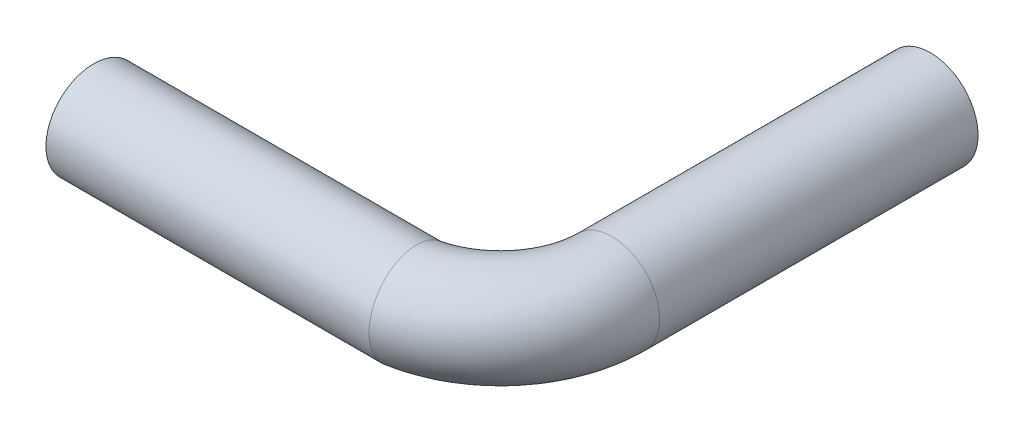
ISO-10303-21;
HEADER;
FILE_DESCRIPTION(('STEP AP214'),'2;1');
FILE_NAME('part.step','',(''),(''),'','','');
FILE_SCHEMA(('AUTOMOTIVE_DESIGN { 1 0 10303 214 1 1 1 1 }'));
ENDSEC;
DATA;
#1=APPLICATION_CONTEXT('core data for automotive mechanical design processes');
#2=APPLICATION_PROTOCOL_DEFINITION('international standard','automotive_design',2000,#1);
#3=PRODUCT_CONTEXT('',#1,'mechanical');
#4=PRODUCT('Part','Part','',(#3));
#5=PRODUCT_RELATED_PRODUCT_CATEGORY('part','',(#4));
#6=PRODUCT_DEFINITION_FORMATION('','',#4);
#7=PRODUCT_DEFINITION_CONTEXT('part definition',#1,'design');
#8=PRODUCT_DEFINITION('design','',#6,#7);
#9=PRODUCT_DEFINITION_SHAPE('','',#8);
#10=(LENGTH_UNIT() NAMED_UNIT(*) SI_UNIT(.MILLI.,.METRE.));
#11=(NAMED_UNIT(*) PLANE_ANGLE_UNIT() SI_UNIT($,.RADIAN.));
#12=(NAMED_UNIT(*) SI_UNIT($,.STERADIAN.) SOLID_ANGLE_UNIT());
#13=UNCERTAINTY_MEASURE_WITH_UNIT(LENGTH_MEASURE(1.E-05),#10,'distance_accuracy_value','');
#14=(GEOMETRIC_REPRESENTATION_CONTEXT(3) GLOBAL_UNCERTAINTY_ASSIGNED_CONTEXT((#13)) GLOBAL_UNIT_ASSIGNED_CONTEXT((#10,
#11,#12)) REPRESENTATION_CONTEXT('',''));
#15=CARTESIAN_POINT('',(0.,0.,0.));
#16=DIRECTION('',(0.,0.,1.));
#17=DIRECTION('',(1.,0.,0.));
#18=AXIS2_PLACEMENT_3D('',#15,#16,#17);
#19=CARTESIAN_POINT('',(-65.472312703583,0.,58.3061889250815));
#20=DIRECTION('',(1.,0.,0.));
#21=DIRECTION('',(0.,0.,-1.));
#22=AXIS2_PLACEMENT_3D('',#19,#20,#21);
#23=PLANE('',#22);
#24=CARTESIAN_POINT('',(-65.472312703583,0.,58.3061889250815));
#25=DIRECTION('',(1.,0.,0.));
#26=DIRECTION('',(0.,0.,-1.));
#27=AXIS2_PLACEMENT_3D('',#24,#25,#26);
#28=CIRCLE('',#27,15.);
#29=CARTESIAN_POINT('',(-65.472312703583,0.,43.3061889250815));
#30=VERTEX_POINT('',#29);
#31=EDGE_CURVE('E50',#30,#30,#28,.T.);
#32=ORIENTED_EDGE('',*,*,#31,.F.);
#33=EDGE_LOOP('',(#32));
#34=FACE_BOUND('',#33,.T.);
#35=ADVANCED_FACE('F47',(#34),#23,.F.);
#36=CARTESIAN_POINT('',(62.8585777324741,0.,-76.0525505399241));
#37=DIRECTION('',(0.,0.,-1.));
#38=DIRECTION('',(-1.,0.,0.));
#39=AXIS2_PLACEMENT_3D('',#36,#37,#38);
#40=PLANE('',#39);
#41=CARTESIAN_POINT('',(62.8585777324741,0.,-76.0525505399241));
#42=DIRECTION('',(0.,0.,-1.));
#43=DIRECTION('',(-1.,0.,0.));
#44=AXIS2_PLACEMENT_3D('',#41,#42,#43);
#45=CIRCLE('',#44,15.);
#46=CARTESIAN_POINT('',(47.8585777324741,0.,-76.0525505399241));
#47=VERTEX_POINT('',#46);
#48=EDGE_CURVE('E75',#47,#47,#45,.T.);
#49=ORIENTED_EDGE('',*,*,#48,.T.);
#50=EDGE_LOOP('',(#49));
#51=FACE_BOUND('',#50,.T.);
#52=ADVANCED_FACE('F70',(#51),#40,.T.);
#53=CARTESIAN_POINT('',(36.2142257579554,0.,58.3061889250814));
#54=DIRECTION('',(-1.,0.,0.));
#55=DIRECTION('',(0.,0.,1.));
#56=AXIS2_PLACEMENT_3D('',#53,#54,#55);
#57=CYLINDRICAL_SURFACE('',#56,15.);
#58=CARTESIAN_POINT('',(34.527687296417,15.,58.3061889250814));
#59=CARTESIAN_POINT('',(34.5258970146689,15.0000000568566,58.2875707761179));
#60=CARTESIAN_POINT('',(34.5241059795635,14.9999653888742,58.2689521512693));
#61=CARTESIAN_POINT('',(34.4816199437743,14.9983201625483,57.8274655230703));
#62=CARTESIAN_POINT('',(34.4405440041453,14.9788367600335,57.4044380138404));
#63=CARTESIAN_POINT('',(34.378575970563,14.9228796147085,56.7723984871578));
#64=CARTESIAN_POINT('',(34.357852185721,14.8997566024416,56.5620480355102));
#65=CARTESIAN_POINT('',(34.3163190895518,14.8446313444666,56.1424677826833));
#66=CARTESIAN_POINT('',(34.2955097617497,14.8126273010082,55.9332382171501));
#67=CARTESIAN_POINT('',(34.2329098435563,14.7031999281993,55.3068905763646));
#68=CARTESIAN_POINT('',(34.1910374429678,14.6124427853828,54.8920330714811));
#69=CARTESIAN_POINT('',(34.1073968922888,14.3961034765611,54.0715380893639));
#70=CARTESIAN_POINT('',(34.0656287439181,14.2705207398372,53.6659007633475));
#71=CARTESIAN_POINT('',(33.9825484946131,13.9855660027348,52.8671138993205));
#72=CARTESIAN_POINT('',(33.9412359456726,13.8262310322062,52.4739512144087));
#73=CARTESIAN_POINT('',(33.8593497904146,13.474803792978,51.7024506999752));
#74=CARTESIAN_POINT('',(33.8187762176678,13.2827100401831,51.3241135430608));
#75=CARTESIAN_POINT('',(33.7387423475721,12.8672597301733,50.5852346499254));
#76=CARTESIAN_POINT('',(33.6992812995707,12.6439248897161,50.224680785425));
#77=CARTESIAN_POINT('',(33.6218025239209,12.1674569763935,49.5236723406661));
#78=CARTESIAN_POINT('',(33.5837847782771,11.914324275218,49.1832175097776));
#79=CARTESIAN_POINT('',(33.5095892872261,11.3802270316736,48.5250898922464));
#80=CARTESIAN_POINT('',(33.4734102107917,11.0992830692625,48.207400555147));
#81=CARTESIAN_POINT('',(33.4032383806132,10.5113757941377,47.596819676194));
#82=CARTESIAN_POINT('',(33.3692456335615,10.2044124017864,47.3039282102447));
#83=CARTESIAN_POINT('',(33.3038208467741,9.56658728805955,46.7450374142214));
#84=CARTESIAN_POINT('',(33.2723891211525,9.2357226445108,46.4790413819626));
#85=CARTESIAN_POINT('',(33.2124645245376,8.55246846660784,45.9759306266298));
#86=CARTESIAN_POINT('',(33.1839716397633,8.20007903320136,45.7388157681234));
#87=CARTESIAN_POINT('',(33.1304159712215,7.47804958774924,45.2963009457944));
#88=CARTESIAN_POINT('',(33.1053371164994,7.10850222007245,45.0907517611364));
#89=CARTESIAN_POINT('',(33.0587784762073,6.35319268905035,44.7115016921926));
#90=CARTESIAN_POINT('',(33.0372986811233,5.96743056857186,44.5378007237163));
#91=CARTESIAN_POINT('',(32.9982387681624,5.18246603191532,44.223548316022));
#92=CARTESIAN_POINT('',(32.9806584259885,4.78326439030201,44.0829949701198));
#93=CARTESIAN_POINT('',(32.94965196609,3.97426607702596,43.8360794781368));
#94=CARTESIAN_POINT('',(32.9362258277977,3.56446945783018,43.7297171627749));
#95=CARTESIAN_POINT('',(32.9138084774522,2.7401161733403,43.552604283818));
#96=CARTESIAN_POINT('',(32.9047870880695,2.32561239221796,43.4816113311416));
#97=CARTESIAN_POINT('',(32.8911783481355,1.49203734757327,43.3746654561419));
#98=CARTESIAN_POINT('',(32.8865909763259,1.07296610595869,43.3387123658253));
#99=CARTESIAN_POINT('',(32.8819214816627,0.233270692588299,43.3021165516213));
#100=CARTESIAN_POINT('',(32.8818392418182,-0.187353438557801,43.3014729108045));
#101=CARTESIAN_POINT('',(32.8861810051607,-1.02714726664923,43.3354985528378));
#102=CARTESIAN_POINT('',(32.8906050009043,-1.44631696599584,43.3701677773581));
#103=CARTESIAN_POINT('',(32.9038619835599,-2.27840682703837,43.4743341677916));
#104=CARTESIAN_POINT('',(32.9126759790514,-2.69134608208205,43.543681319888));
#105=CARTESIAN_POINT('',(32.9345698585346,-3.50987515276862,43.7166121886742));
#106=CARTESIAN_POINT('',(32.9476497271113,-3.9154649949634,43.8201957816488));
#107=CARTESIAN_POINT('',(32.9778823979753,-4.7164403421658,44.0608366379397));
#108=CARTESIAN_POINT('',(32.9950352708174,-5.11182567027344,44.1978944811173));
#109=CARTESIAN_POINT('',(33.033169056893,-5.88961012783061,44.5044778086699));
#110=CARTESIAN_POINT('',(33.0541499822617,-6.27200921610792,44.6740033959709));
#111=CARTESIAN_POINT('',(33.0997055476351,-7.02201803919799,45.0447164607831));
#112=CARTESIAN_POINT('',(33.1242883752193,-7.38959157929288,45.2459761554803));
#113=CARTESIAN_POINT('',(33.1766902746422,-8.10645138456053,45.6784151550098));
#114=CARTESIAN_POINT('',(33.2045093497324,-8.45573763135974,45.909594489902));
#115=CARTESIAN_POINT('',(33.2630381174555,-9.13358500731653,46.400196479165));
#116=CARTESIAN_POINT('',(33.2937476310764,-9.46214741785112,46.65961738462));
#117=CARTESIAN_POINT('',(33.3577016376559,-10.0963108147469,47.2048658033168));
#118=CARTESIAN_POINT('',(33.3909461376827,-10.4019117370814,47.4906933901871));
#119=CARTESIAN_POINT('',(33.4598296812589,-10.9899563736595,48.088663136045));
#120=CARTESIAN_POINT('',(33.4954828167249,-11.2722375941045,48.40096348014));
#121=CARTESIAN_POINT('',(33.5686213843518,-11.8094738339934,49.0480483413191));
#122=CARTESIAN_POINT('',(33.6061068388033,-12.0644285208815,49.3828331319516));
#123=CARTESIAN_POINT('',(33.6825663369205,-12.5453704455753,50.0726861807949));
#124=CARTESIAN_POINT('',(33.7215411031993,-12.771343383744,50.4277643278279));
#125=CARTESIAN_POINT('',(33.8006083542709,-13.1926117161871,51.1555405113711));
#126=CARTESIAN_POINT('',(33.8407008059536,-13.3879080180803,51.5282380261585));
#127=CARTESIAN_POINT('',(33.9219371284363,-13.7476881621349,52.2911953665924));
#128=CARTESIAN_POINT('',(33.9630862441106,-13.911956786385,52.6815561321799));
#129=CARTESIAN_POINT('',(34.0458451614951,-14.2068981356641,53.4747231208562));
#130=CARTESIAN_POINT('',(34.087454961172,-14.3375710089044,53.877529289032));
#131=CARTESIAN_POINT('',(34.1707490812473,-14.5642098163489,54.6920215981234));
#132=CARTESIAN_POINT('',(34.2124331540471,-14.6602344795206,55.1036914476161));
#133=CARTESIAN_POINT('',(34.2956381104611,-14.8171705595948,55.9335099678859));
#134=CARTESIAN_POINT('',(34.3371590689645,-14.8781005913095,56.3516550829752));
#135=CARTESIAN_POINT('',(34.4026252939717,-14.9465616521432,57.017251524781));
#136=CARTESIAN_POINT('',(34.4267160521432,-14.9657591681233,57.2635521193177));
#137=CARTESIAN_POINT('',(34.4746841267609,-14.9919623593182,57.7566822206236));
#138=CARTESIAN_POINT('',(34.4985615824254,-14.998976668764,58.0035112285929));
#139=CARTESIAN_POINT('',(34.5241059493072,-14.9999653530509,58.2689518773159));
#140=CARTESIAN_POINT('',(34.52589698377,-15.0000000200488,58.287570498093));
#141=CARTESIAN_POINT('',(34.5276872964171,-15.,58.3061889250814));
#142=B_SPLINE_CURVE_WITH_KNOTS('',3,(#58,#59,#60,#61,#62,#63,#64,#65,#66,#67,#68,#69,#70,#71,
#72,#73,#74,#75,#76,#77,#78,#79,#80,#81,#82,#83,#84,#85,#86,#87,#88,#89,#90,#91,#92,#93,#94,#95,
#96,#97,#98,#99,#100,#101,#102,#103,#104,#105,#106,#107,#108,#109,#110,#111,#112,#113,#114,#115,
#116,#117,#118,#119,#120,#121,#122,#123,#124,#125,#126,#127,#128,#129,#130,#131,#132,#133,#134,
#135,#136,#137,#138,#139,#140,#141),.UNSPECIFIED.,.F.,.F.,(4,2,2,2,2,2,2,2,2,2,2,2,2,2,2,2,2,2,
2,2,2,2,2,2,2,2,2,2,2,2,2,2,2,2,2,2,2,2,2,2,2,4),(0.,0.0561136445299917,1.33055000999383,
1.9683025715183,2.60618432494571,3.8847213356176,5.16327930007552,6.44044174655828,
7.71766206865719,8.99399892251827,10.2703198574098,11.5457032934931,12.8210906332838,
14.0966341670338,15.3721717191542,16.641480357276,17.9107856399477,19.180017893107,
20.4492438621539,21.7096477821258,22.9700456592458,24.2304108058539,25.4907738705953,
26.7457312733994,28.0006841413993,29.2556587499945,30.5106373370512,31.76851422662,
33.0263923799749,34.2841926809786,35.541996489154,36.8079324389693,38.0738837930995,
39.3404573859703,40.6069934981129,41.8820156893897,43.157032255671,44.4298773932297,
45.7020467680433,46.4464562626714,47.1903379791566,47.2464516236861),.UNSPECIFIED.);
#143=CARTESIAN_POINT('',(34.527687296417,15.,58.3061889250814));
#144=VERTEX_POINT('',#143);
#145=CARTESIAN_POINT('',(34.5276872964171,-15.,58.3061889250814));
#146=VERTEX_POINT('',#145);
#147=EDGE_CURVE('E55',#144,#146,#142,.T.);
#148=ORIENTED_EDGE('',*,*,#147,.T.);
#149=CARTESIAN_POINT('',(34.527687296417,15.,58.3061889250814));
#150=CARTESIAN_POINT('',(34.529477570219,15.000000056522,58.3248070749815));
#151=CARTESIAN_POINT('',(34.5312678929445,14.9999653885559,58.3434257683473));
#152=CARTESIAN_POINT('',(34.5736720306283,14.9983220213722,58.784413888569));
#153=CARTESIAN_POINT('',(34.6143028438155,14.9788827092968,59.2069772452432));
#154=CARTESIAN_POINT('',(34.6750143871948,14.9230403377799,59.8383851156752));
#155=CARTESIAN_POINT('',(34.6952208419859,14.8999637674077,60.0485354323206));
#156=CARTESIAN_POINT('',(34.7355284114655,14.8449451573439,60.4677370188053));
#157=CARTESIAN_POINT('',(34.7556295039211,14.8130013176581,60.6767880567102));
#158=CARTESIAN_POINT('',(34.8158067318733,14.7037720874677,61.3026307058402));
#159=CARTESIAN_POINT('',(34.8556687387951,14.6131699990527,61.7171958325718));
#160=CARTESIAN_POINT('',(34.9345148314407,14.3971666368983,62.5371953825693));
#161=CARTESIAN_POINT('',(34.9734989040977,14.2717648455788,62.942629669934));
#162=CARTESIAN_POINT('',(35.0502771698381,13.9871699842911,63.7411235837195));
#163=CARTESIAN_POINT('',(35.0880725307427,13.828011349502,64.1341953553923));
#164=CARTESIAN_POINT('',(35.1622442504308,13.4769288645357,64.905581253521));
#165=CARTESIAN_POINT('',(35.198620544784,13.2850035287646,65.2838947099008));
#166=CARTESIAN_POINT('',(35.2696666905571,12.8698774293084,66.0227746223603));
#167=CARTESIAN_POINT('',(35.3043377140301,12.646698564205,66.383353267788));
#168=CARTESIAN_POINT('',(35.371750258985,12.1705302324712,67.0844437362689));
#169=CARTESIAN_POINT('',(35.4044918064537,11.9175411674714,67.4249558295846));
#170=CARTESIAN_POINT('',(35.4677448701909,11.3840715851976,68.0827876921797));
#171=CARTESIAN_POINT('',(35.4982607739563,11.1036478563528,68.4001530914256));
#172=CARTESIAN_POINT('',(35.5569148728401,10.5168532418171,69.0101557198698));
#173=CARTESIAN_POINT('',(35.5850530631837,10.2104823040217,69.3027928994091));
#174=CARTESIAN_POINT('',(35.6387503257221,9.57392202729532,69.8612444297715));
#175=CARTESIAN_POINT('',(35.6643090878002,9.24372983257232,70.1270555553811));
#176=CARTESIAN_POINT('',(35.712656897099,8.56190641692292,70.6298727720773));
#177=CARTESIAN_POINT('',(35.7354459547965,8.21027527710107,70.8668789721243));
#178=CARTESIAN_POINT('',(35.7779927060705,7.48968468891827,71.3093651853622));
#179=CARTESIAN_POINT('',(35.7977633824543,7.12080891361808,71.5149802197493));
#180=CARTESIAN_POINT('',(35.8342495253346,6.36691620791975,71.8944361056975));
#181=CARTESIAN_POINT('',(35.8509649998994,5.9818993201508,72.0682770411686));
#182=CARTESIAN_POINT('',(35.8812176357015,5.19848580928535,72.3829044535075));
#183=CARTESIAN_POINT('',(35.8947549268205,4.80008973371176,72.5236922811439));
#184=CARTESIAN_POINT('',(35.9185525381886,3.99275317727197,72.7711874393714));
#185=CARTESIAN_POINT('',(35.9288128662862,3.58381272166285,72.8778948515877));
#186=CARTESIAN_POINT('',(35.9459461320144,2.75999563007208,73.0560808151615));
#187=CARTESIAN_POINT('',(35.952832636714,2.34514978927235,73.1277004640374));
#188=CARTESIAN_POINT('',(35.9632298043073,1.51086605958227,73.2358310070086));
#189=CARTESIAN_POINT('',(35.9667404769075,1.09142818389879,73.2723420020508));
#190=CARTESIAN_POINT('',(35.9703602316687,0.250958081856539,73.3099874515685));
#191=CARTESIAN_POINT('',(35.9704693523211,-0.170074126407141,73.3111223063538));
#192=CARTESIAN_POINT('',(35.9672852997873,-1.01073177954586,73.2780081600027));
#193=CARTESIAN_POINT('',(35.9639921285983,-1.43035722524653,73.2437591796368));
#194=CARTESIAN_POINT('',(35.954037489794,-2.26438279188021,73.1402309360699));
#195=CARTESIAN_POINT('',(35.9473826746126,-2.67879158251933,73.0710208581822));
#196=CARTESIAN_POINT('',(35.9307568041842,-3.50028171415218,72.898111805726));
#197=CARTESIAN_POINT('',(35.9207857549539,-3.90736306843878,72.7944128937313));
#198=CARTESIAN_POINT('',(35.8975999336736,-4.71131717236497,72.5532803524179));
#199=CARTESIAN_POINT('',(35.8843851335184,-5.10818983351908,72.4158464308044));
#200=CARTESIAN_POINT('',(35.8548078463609,-5.8889178085678,72.1082426443686));
#201=CARTESIAN_POINT('',(35.8384453545013,-6.27277310237381,71.9380727290302));
#202=CARTESIAN_POINT('',(35.8026729566741,-7.02514427569544,71.566039791634));
#203=CARTESIAN_POINT('',(35.783259962731,-7.39364412763505,71.3641446546294));
#204=CARTESIAN_POINT('',(35.7415390001488,-8.11229619353958,70.930246643785));
#205=CARTESIAN_POINT('',(35.7192310322948,-8.46244841247956,70.6982437781091));
#206=CARTESIAN_POINT('',(35.6718822280521,-9.14193111975983,70.2058162140055));
#207=CARTESIAN_POINT('',(35.6468415634762,-9.47126291508738,69.9453933024295));
#208=CARTESIAN_POINT('',(35.5942057281464,-10.1068324414608,69.3979806149964));
#209=CARTESIAN_POINT('',(35.5666105477991,-10.4130700857689,69.1109907393673));
#210=CARTESIAN_POINT('',(35.5088332155833,-11.0026652831332,68.5101064844177));
#211=CARTESIAN_POINT('',(35.4786322110824,-11.285821193038,68.196016037721));
#212=CARTESIAN_POINT('',(35.4160524810034,-11.8245239555765,67.5451868446283));
#213=CARTESIAN_POINT('',(35.3836737240406,-12.0800704101785,67.2084477718317));
#214=CARTESIAN_POINT('',(35.3169551719213,-12.561882357302,66.5145748308708));
#215=CARTESIAN_POINT('',(35.2826144288921,-12.7881335213322,66.1574311048315));
#216=CARTESIAN_POINT('',(35.2122333826351,-13.2096257433377,65.4254682197656));
#217=CARTESIAN_POINT('',(35.1761931377424,-13.4048678646868,65.0506496674227));
#218=CARTESIAN_POINT('',(35.1026454683445,-13.7631127209288,64.2857539205994));
#219=CARTESIAN_POINT('',(35.0651371157836,-13.9260946552316,63.8956670743548));
#220=CARTESIAN_POINT('',(34.988941660362,-14.2185341298507,63.1032342822578));
#221=CARTESIAN_POINT('',(34.9502545641184,-14.3479918583235,62.7008884052241));
#222=CARTESIAN_POINT('',(34.8720449989851,-14.5722970463217,61.887509135567));
#223=CARTESIAN_POINT('',(34.8325240839943,-14.6672037444489,61.4764919028732));
#224=CARTESIAN_POINT('',(34.7528762263866,-14.8220300119102,60.6481534099759));
#225=CARTESIAN_POINT('',(34.7127496165975,-14.8819681263976,60.2308356118938));
#226=CARTESIAN_POINT('',(34.6492957278701,-14.948551231699,59.5709082769026));
#227=CARTESIAN_POINT('',(34.6260756285957,-14.9670193459873,59.3294156303307));
#228=CARTESIAN_POINT('',(34.5795893575856,-14.9922370842293,58.8459574905018));
#229=CARTESIAN_POINT('',(34.5563232289789,-14.9989948276049,58.6039924414137));
#230=CARTESIAN_POINT('',(34.5312679196177,-14.9999653524662,58.343426046675));
#231=CARTESIAN_POINT('',(34.5294775972789,-15.0000000194458,58.3248073573649));
#232=CARTESIAN_POINT('',(34.5276872964171,-15.,58.3061889250814));
#233=B_SPLINE_CURVE_WITH_KNOTS('',3,(#149,#150,#151,#152,#153,#154,#155,#156,#157,#158,#159,
#160,#161,#162,#163,#164,#165,#166,#167,#168,#169,#170,#171,#172,#173,#174,#175,#176,#177,#178,
#179,#180,#181,#182,#183,#184,#185,#186,#187,#188,#189,#190,#191,#192,#193,#194,#195,#196,#197,
#198,#199,#200,#201,#202,#203,#204,#205,#206,#207,#208,#209,#210,#211,#212,#213,#214,#215,#216,
#217,#218,#219,#220,#221,#222,#223,#224,#225,#226,#227,#228,#229,#230,#231,#232),.UNSPECIFIED.,
.F.,.F.,(4,2,2,2,2,2,2,2,2,2,2,2,2,2,2,2,2,2,2,2,2,2,2,2,2,2,2,2,2,2,2,2,2,2,2,2,2,2,2,2,2,4),
(0.,0.0561136444905724,1.32903788059825,1.96603206525042,2.6031556499882,3.88016527348185,
5.15719389110304,6.43292603062844,7.70871602533629,8.98361653680854,10.2584998736007,
11.5307979582306,12.8030985978167,14.0755520204093,15.3480006295484,16.6148117979033,
17.881619620779,19.1483756644959,20.41512867422,21.6767450343911,22.9383577670577,
24.1999562235447,25.4615539394705,26.7206647745739,27.979773325262,29.238892785798,
30.4980141893368,31.7584184917304,33.0188224523566,34.2791472132971,35.5394767075734,
36.8098435972327,38.0802287986976,39.3512330242864,40.6221936547003,41.8939711193499,
43.1657414459222,44.4353209055703,45.7042264460492,46.4339185190125,47.1631044549873,
47.2192180994774),.UNSPECIFIED.);
#234=EDGE_CURVE('E12',#144,#146,#233,.T.);
#235=ORIENTED_EDGE('',*,*,#234,.F.);
#236=EDGE_LOOP('',(#148,#235));
#237=FACE_BOUND('',#236,.T.);
#238=ORIENTED_EDGE('',*,*,#31,.T.);
#239=EDGE_LOOP('',(#238));
#240=FACE_BOUND('',#239,.T.);
#241=ADVANCED_FACE('F66',(#237,#240),#57,.T.);
#242=CARTESIAN_POINT('',(62.8585777324741,0.,-76.0525505399241));
#243=DIRECTION('',(0.,0.,1.));
#244=DIRECTION('',(1.,0.,0.));
#245=AXIS2_PLACEMENT_3D('',#242,#243,#244);
#246=CYLINDRICAL_SURFACE('',#245,15.);
#247=CARTESIAN_POINT('',(62.8585777324741,0.,23.9474494600759));
#248=DIRECTION('',(0.,0.,-1.));
#249=DIRECTION('',(-1.,0.,0.));
#250=AXIS2_PLACEMENT_3D('',#247,#248,#249);
#251=CIRCLE('',#250,15.);
#252=CARTESIAN_POINT('',(47.8585777324741,0.,23.9474494600759));
#253=VERTEX_POINT('',#252);
#254=EDGE_CURVE('E65',#253,#253,#251,.T.);
#255=ORIENTED_EDGE('',*,*,#254,.T.);
#256=EDGE_LOOP('',(#255));
#257=FACE_BOUND('',#256,.T.);
#258=ORIENTED_EDGE('',*,*,#48,.F.);
#259=EDGE_LOOP('',(#258));
#260=FACE_BOUND('',#259,.T.);
#261=ADVANCED_FACE('F69',(#257,#260),#246,.T.);
#262=CARTESIAN_POINT('',(47.8585777324741,0.,23.9474494600759));
#263=CARTESIAN_POINT('',(47.8585777324741,0.,23.9968305094194));
#264=CARTESIAN_POINT('',(47.8584809988731,0.,24.0192763097015));
#265=CARTESIAN_POINT('',(47.8580940710086,0.,24.091101770621));
#266=CARTESIAN_POINT('',(47.8578038767428,0.,24.1270138723643));
#267=CARTESIAN_POINT('',(47.8566431197341,0.,24.2347467934845));
#268=CARTESIAN_POINT('',(47.8554823803537,0.,24.3065642304976));
#269=CARTESIAN_POINT('',(47.8508396784876,0.,24.5219909650765));
#270=CARTESIAN_POINT('',(47.8461971911928,0.,24.6655747094402));
#271=CARTESIAN_POINT('',(47.827630869545,0.,25.0961264426918));
#272=CARTESIAN_POINT('',(47.8090674634863,0.,25.3828951826267));
#273=CARTESIAN_POINT('',(47.7348697896074,0.,26.2416146192052));
#274=CARTESIAN_POINT('',(47.6607159020942,0.,26.811978510541));
#275=CARTESIAN_POINT('',(47.3650117809286,0.,28.5103259422107));
#276=CARTESIAN_POINT('',(47.0700623584483,0.,29.6254413498732));
#277=CARTESIAN_POINT('',(45.9048112317895,0.,32.8702511627696));
#278=CARTESIAN_POINT('',(44.7516051059859,0.,34.8977261641118));
#279=CARTESIAN_POINT('',(41.8271250114811,0.,38.4444360660115));
#280=CARTESIAN_POINT('',(40.0565356505988,0.,39.9628406922691));
#281=CARTESIAN_POINT('',(37.0932103046884,0.,41.7250278857246));
#282=CARTESIAN_POINT('',(36.0547812292798,0.,42.2270278848448));
#283=CARTESIAN_POINT('',(34.443942356129,0.,42.8409181082598));
#284=CARTESIAN_POINT('',(33.8981672499139,0.,43.0223950989376));
#285=CARTESIAN_POINT('',(33.0693040841012,0.,43.2588678195472));
#286=CARTESIAN_POINT('',(32.7913168497119,0.,43.3317378519591));
#287=CARTESIAN_POINT('',(32.3721671448393,0.,43.4320112599006));
#288=CARTESIAN_POINT('',(32.2320890739071,0.,43.4639306382336));
#289=CARTESIAN_POINT('',(32.021476865049,0.,43.5095411317175));
#290=CARTESIAN_POINT('',(31.9511902746801,0.,43.5243665448101));
#291=CARTESIAN_POINT('',(31.8456424645191,0.,43.54603626661));
#292=CARTESIAN_POINT('',(31.8104402067239,0.,43.5531647749032));
#293=CARTESIAN_POINT('',(31.7399973548143,0.,43.5672321229066));
#294=CARTESIAN_POINT('',(31.717978940156,0.,43.5716042461432));
#295=CARTESIAN_POINT('',(31.6152950989278,0.,43.5915359670534));
#296=CARTESIAN_POINT('',(31.5315276366378,0.,43.6077951300404));
#297=CARTESIAN_POINT('',(31.3935577899757,0.,43.6345753914306));
#298=CARTESIAN_POINT('',(31.3245728666454,0.,43.6479655221254));
#299=CARTESIAN_POINT('',(31.1176180966538,0.,43.6881359142108));
#300=CARTESIAN_POINT('',(30.9796482499932,0.,43.7149161756004));
#301=CARTESIAN_POINT('',(30.565738710007,0.,43.795256959771));
#302=CARTESIAN_POINT('',(30.28979901669,0.,43.8488174825512));
#303=CARTESIAN_POINT('',(30.0138593233639,0.,43.9023780053306));
#304=CARTESIAN_POINT('',(47.8585777324741,30.,23.9474494600759));
#305=CARTESIAN_POINT('',(47.8585777324741,30.,23.9968305094194));
#306=CARTESIAN_POINT('',(47.8584809988731,30.,24.0192763097015));
#307=CARTESIAN_POINT('',(47.8580940710086,30.,24.091101770621));
#308=CARTESIAN_POINT('',(47.8578038767428,30.,24.1270138723643));
#309=CARTESIAN_POINT('',(47.8566431197341,30.,24.2347467934845));
#310=CARTESIAN_POINT('',(47.8554823803537,30.,24.3065642304976));
#311=CARTESIAN_POINT('',(47.8508396784876,30.,24.5219909650765));
#312=CARTESIAN_POINT('',(47.8461971911928,30.,24.6655747094402));
#313=CARTESIAN_POINT('',(47.827630869545,30.,25.0961264426918));
#314=CARTESIAN_POINT('',(47.8090674634863,30.,25.3828951826267));
#315=CARTESIAN_POINT('',(47.7348697896074,30.,26.2416146192052));
#316=CARTESIAN_POINT('',(47.6607159020942,30.,26.811978510541));
#317=CARTESIAN_POINT('',(47.3650117809286,30.,28.5103259422107));
#318=CARTESIAN_POINT('',(47.0700623584483,30.,29.6254413498732));
#319=CARTESIAN_POINT('',(45.9048112317895,30.,32.8702511627696));
#320=CARTESIAN_POINT('',(44.7516051059859,30.,34.8977261641118));
#321=CARTESIAN_POINT('',(41.8271250114811,30.,38.4444360660115));
#322=CARTESIAN_POINT('',(40.0565356505988,30.,39.9628406922691));
#323=CARTESIAN_POINT('',(37.0932103046884,30.,41.7250278857246));
#324=CARTESIAN_POINT('',(36.0547812292798,30.,42.2270278848448));
#325=CARTESIAN_POINT('',(34.443942356129,30.,42.8409181082598));
#326=CARTESIAN_POINT('',(33.8981672499139,30.,43.0223950989376));
#327=CARTESIAN_POINT('',(33.0693040841012,30.,43.2588678195472));
#328=CARTESIAN_POINT('',(32.7913168497119,30.,43.3317378519591));
#329=CARTESIAN_POINT('',(32.3721671448393,30.,43.4320112599006));
#330=CARTESIAN_POINT('',(32.2320890739071,30.,43.4639306382336));
#331=CARTESIAN_POINT('',(32.021476865049,30.,43.5095411317175));
#332=CARTESIAN_POINT('',(31.9511902746801,30.,43.5243665448101));
#333=CARTESIAN_POINT('',(31.8456424645191,30.,43.54603626661));
#334=CARTESIAN_POINT('',(31.8104402067239,30.,43.5531647749032));
#335=CARTESIAN_POINT('',(31.7399973548143,30.,43.5672321229066));
#336=CARTESIAN_POINT('',(31.717978940156,30.,43.5716042461432));
#337=CARTESIAN_POINT('',(31.6152950989278,30.,43.5915359670534));
#338=CARTESIAN_POINT('',(31.5315276366378,30.,43.6077951300404));
#339=CARTESIAN_POINT('',(31.3935577899757,30.,43.6345753914306));
#340=CARTESIAN_POINT('',(31.3245728666454,30.,43.6479655221254));
#341=CARTESIAN_POINT('',(31.1176180966538,30.,43.6881359142108));
#342=CARTESIAN_POINT('',(30.9796482499932,30.,43.7149161756004));
#343=CARTESIAN_POINT('',(30.565738710007,30.,43.795256959771));
#344=CARTESIAN_POINT('',(30.28979901669,30.,43.8488174825512));
#345=CARTESIAN_POINT('',(30.0138593233639,30.,43.9023780053306));
#346=CARTESIAN_POINT('',(77.8585777324741,30.,23.9474494600759));
#347=CARTESIAN_POINT('',(77.8585777324741,30.,24.0237656272431));
#348=CARTESIAN_POINT('',(77.8583358984715,30.,24.1270165841401));
#349=CARTESIAN_POINT('',(77.8573685788103,30.,24.3065802364384));
#350=CARTESIAN_POINT('',(77.8566430931442,30.,24.3963604907969));
#351=CARTESIAN_POINT('',(77.8537412006274,30.,24.6656927935969));
#352=CARTESIAN_POINT('',(77.8508393521744,30.,24.8452363861295));
#353=CARTESIAN_POINT('',(77.8392325975052,30.,25.3838032225782));
#354=CARTESIAN_POINT('',(77.8276263792744,30.,25.7427625834847));
#355=CARTESIAN_POINT('',(77.7812105751444,30.,26.8191419166191));
#356=CARTESIAN_POINT('',(77.7348020600045,30.,27.5360637664519));
#357=CARTESIAN_POINT('',(77.5493078753073,30.,29.6828623579007));
#358=CARTESIAN_POINT('',(77.3639231565121,30.,31.1087720862491));
#359=CARTESIAN_POINT('',(76.6246628536348,30.,35.3546406653918));
#360=CARTESIAN_POINT('',(75.8872892974062,30.,38.142429184569));
#361=CARTESIAN_POINT('',(72.9741614807695,30.,46.2544537168101));
#362=CARTESIAN_POINT('',(70.0911461662814,30.,51.3231412201516));
#363=CARTESIAN_POINT('',(62.7799459299636,30.,60.1899159749288));
#364=CARTESIAN_POINT('',(58.3534725278695,30.,63.9859275406216));
#365=CARTESIAN_POINT('',(50.9451591629679,30.,68.3913955241662));
#366=CARTESIAN_POINT('',(48.3490864744743,30.,69.6463955219492));
#367=CARTESIAN_POINT('',(44.3219892916183,30.,71.1811210805599));
#368=CARTESIAN_POINT('',(42.9575515260752,30.,71.6348135572142));
#369=CARTESIAN_POINT('',(40.8853936115409,30.,72.225995358762));
#370=CARTESIAN_POINT('',(40.1904255255659,30.,72.4081704397856));
#371=CARTESIAN_POINT('',(39.1425512633883,30.,72.6588539596366));
#372=CARTESIAN_POINT('',(38.7923560860579,30.,72.7386524054667));
#373=CARTESIAN_POINT('',(38.2658255639106,30.,72.8526786391815));
#374=CARTESIAN_POINT('',(38.0901090879881,30.,72.8897421719097));
#375=CARTESIAN_POINT('',(37.8262395625873,30.,72.9439164764119));
#376=CARTESIAN_POINT('',(37.7382339180993,30.,72.9617377471428));
#377=CARTESIAN_POINT('',(37.5621267883238,30.,72.9969061171539));
#378=CARTESIAN_POINT('',(37.4608029501152,30.,73.0168190518999));
#379=CARTESIAN_POINT('',(37.3021098411063,30.,73.0476231294992));
#380=CARTESIAN_POINT('',(37.2479072628746,30.,73.058143242902));
#381=CARTESIAN_POINT('',(37.1099374162125,30.,73.0849235042927));
#382=CARTESIAN_POINT('',(37.0409524928822,30.,73.0983136349875));
#383=CARTESIAN_POINT('',(36.8339977228906,30.,73.1384840270721));
#384=CARTESIAN_POINT('',(36.69602787623,30.,73.1652642884617));
#385=CARTESIAN_POINT('',(36.2821183362438,30.,73.2456050726339));
#386=CARTESIAN_POINT('',(36.0061786429268,30.,73.2991655954169));
#387=CARTESIAN_POINT('',(35.7302389496007,30.,73.3527261181925));
#388=CARTESIAN_POINT('',(77.8585777324741,0.,23.9474494600759));
#389=CARTESIAN_POINT('',(77.8585777324741,0.,24.0237656272431));
#390=CARTESIAN_POINT('',(77.8583358984715,0.,24.1270165841401));
#391=CARTESIAN_POINT('',(77.8573685788103,0.,24.3065802364384));
#392=CARTESIAN_POINT('',(77.8566430931442,0.,24.3963604907969));
#393=CARTESIAN_POINT('',(77.8537412006274,0.,24.6656927935969));
#394=CARTESIAN_POINT('',(77.8508393521744,0.,24.8452363861295));
#395=CARTESIAN_POINT('',(77.8392325975052,0.,25.3838032225782));
#396=CARTESIAN_POINT('',(77.8276263792744,0.,25.7427625834847));
#397=CARTESIAN_POINT('',(77.7812105751444,0.,26.8191419166191));
#398=CARTESIAN_POINT('',(77.7348020600045,0.,27.5360637664519));
#399=CARTESIAN_POINT('',(77.5493078753073,0.,29.6828623579007));
#400=CARTESIAN_POINT('',(77.3639231565121,0.,31.1087720862491));
#401=CARTESIAN_POINT('',(76.6246628536348,0.,35.3546406653918));
#402=CARTESIAN_POINT('',(75.8872892974062,0.,38.142429184569));
#403=CARTESIAN_POINT('',(72.9741614807695,0.,46.2544537168101));
#404=CARTESIAN_POINT('',(70.0911461662814,0.,51.3231412201516));
#405=CARTESIAN_POINT('',(62.7799459299636,0.,60.1899159749288));
#406=CARTESIAN_POINT('',(58.3534725278695,0.,63.9859275406216));
#407=CARTESIAN_POINT('',(50.9451591629679,0.,68.3913955241662));
#408=CARTESIAN_POINT('',(48.3490864744743,0.,69.6463955219492));
#409=CARTESIAN_POINT('',(44.3219892916183,0.,71.1811210805599));
#410=CARTESIAN_POINT('',(42.9575515260752,0.,71.6348135572142));
#411=CARTESIAN_POINT('',(40.8853936115409,0.,72.225995358762));
#412=CARTESIAN_POINT('',(40.1904255255659,0.,72.4081704397856));
#413=CARTESIAN_POINT('',(39.1425512633883,0.,72.6588539596366));
#414=CARTESIAN_POINT('',(38.7923560860579,0.,72.7386524054667));
#415=CARTESIAN_POINT('',(38.2658255639106,0.,72.8526786391815));
#416=CARTESIAN_POINT('',(38.0901090879881,0.,72.8897421719097));
#417=CARTESIAN_POINT('',(37.8262395625873,0.,72.9439164764119));
#418=CARTESIAN_POINT('',(37.7382339180993,0.,72.9617377471428));
#419=CARTESIAN_POINT('',(37.5621267883238,0.,72.9969061171539));
#420=CARTESIAN_POINT('',(37.4608029501152,0.,73.0168190518999));
#421=CARTESIAN_POINT('',(37.3021098411063,0.,73.0476231294992));
#422=CARTESIAN_POINT('',(37.2479072628746,0.,73.058143242902));
#423=CARTESIAN_POINT('',(37.1099374162125,0.,73.0849235042927));
#424=CARTESIAN_POINT('',(37.0409524928822,0.,73.0983136349875));
#425=CARTESIAN_POINT('',(36.8339977228906,0.,73.1384840270721));
#426=CARTESIAN_POINT('',(36.69602787623,0.,73.1652642884617));
#427=CARTESIAN_POINT('',(36.2821183362438,0.,73.2456050726339));
#428=CARTESIAN_POINT('',(36.0061786429268,0.,73.2991655954169));
#429=CARTESIAN_POINT('',(35.7302389496007,0.,73.3527261181925));
#430=CARTESIAN_POINT('',(77.8585777324741,-30.,23.9474494600759));
#431=CARTESIAN_POINT('',(77.8585777324741,-30.,24.0237656272431));
#432=CARTESIAN_POINT('',(77.8583358984715,-30.,24.1270165841401));
#433=CARTESIAN_POINT('',(77.8573685788103,-30.,24.3065802364384));
#434=CARTESIAN_POINT('',(77.8566430931442,-30.,24.3963604907969));
#435=CARTESIAN_POINT('',(77.8537412006274,-30.,24.6656927935969));
#436=CARTESIAN_POINT('',(77.8508393521744,-30.,24.8452363861295));
#437=CARTESIAN_POINT('',(77.8392325975052,-30.,25.3838032225782));
#438=CARTESIAN_POINT('',(77.8276263792744,-30.,25.7427625834847));
#439=CARTESIAN_POINT('',(77.7812105751444,-30.,26.8191419166191));
#440=CARTESIAN_POINT('',(77.7348020600045,-30.,27.5360637664519));
#441=CARTESIAN_POINT('',(77.5493078753073,-30.,29.6828623579007));
#442=CARTESIAN_POINT('',(77.3639231565121,-30.,31.1087720862491));
#443=CARTESIAN_POINT('',(76.6246628536348,-30.,35.3546406653918));
#444=CARTESIAN_POINT('',(75.8872892974062,-30.,38.142429184569));
#445=CARTESIAN_POINT('',(72.9741614807695,-30.,46.2544537168101));
#446=CARTESIAN_POINT('',(70.0911461662814,-30.,51.3231412201516));
#447=CARTESIAN_POINT('',(62.7799459299636,-30.,60.1899159749288));
#448=CARTESIAN_POINT('',(58.3534725278695,-30.,63.9859275406216));
#449=CARTESIAN_POINT('',(50.9451591629679,-30.,68.3913955241662));
#450=CARTESIAN_POINT('',(48.3490864744743,-30.,69.6463955219492));
#451=CARTESIAN_POINT('',(44.3219892916183,-30.,71.1811210805599));
#452=CARTESIAN_POINT('',(42.9575515260752,-30.,71.6348135572142));
#453=CARTESIAN_POINT('',(40.8853936115409,-30.,72.225995358762));
#454=CARTESIAN_POINT('',(40.1904255255659,-30.,72.4081704397856));
#455=CARTESIAN_POINT('',(39.1425512633883,-30.,72.6588539596366));
#456=CARTESIAN_POINT('',(38.7923560860579,-30.,72.7386524054667));
#457=CARTESIAN_POINT('',(38.2658255639106,-30.,72.8526786391815));
#458=CARTESIAN_POINT('',(38.0901090879881,-30.,72.8897421719097));
#459=CARTESIAN_POINT('',(37.8262395625873,-30.,72.9439164764119));
#460=CARTESIAN_POINT('',(37.7382339180993,-30.,72.9617377471428));
#461=CARTESIAN_POINT('',(37.5621267883238,-30.,72.9969061171539));
#462=CARTESIAN_POINT('',(37.4608029501152,-30.,73.0168190518999));
#463=CARTESIAN_POINT('',(37.3021098411063,-30.,73.0476231294992));
#464=CARTESIAN_POINT('',(37.2479072628746,-30.,73.058143242902));
#465=CARTESIAN_POINT('',(37.1099374162125,-30.,73.0849235042927));
#466=CARTESIAN_POINT('',(37.0409524928822,-30.,73.0983136349875));
#467=CARTESIAN_POINT('',(36.8339977228906,-30.,73.1384840270721));
#468=CARTESIAN_POINT('',(36.69602787623,-30.,73.1652642884617));
#469=CARTESIAN_POINT('',(36.2821183362438,-30.,73.2456050726339));
#470=CARTESIAN_POINT('',(36.0061786429268,-30.,73.2991655954169));
#471=CARTESIAN_POINT('',(35.7302389496007,-30.,73.3527261181925));
#472=CARTESIAN_POINT('',(47.8585777324741,-30.,23.9474494600759));
#473=CARTESIAN_POINT('',(47.8585777324741,-30.,23.9968305094194));
#474=CARTESIAN_POINT('',(47.8584809988731,-30.,24.0192763097015));
#475=CARTESIAN_POINT('',(47.8580940710086,-30.,24.091101770621));
#476=CARTESIAN_POINT('',(47.8578038767428,-30.,24.1270138723643));
#477=CARTESIAN_POINT('',(47.8566431197341,-30.,24.2347467934845));
#478=CARTESIAN_POINT('',(47.8554823803537,-30.,24.3065642304976));
#479=CARTESIAN_POINT('',(47.8508396784876,-30.,24.5219909650765));
#480=CARTESIAN_POINT('',(47.8461971911928,-30.,24.6655747094402));
#481=CARTESIAN_POINT('',(47.827630869545,-30.,25.0961264426918));
#482=CARTESIAN_POINT('',(47.8090674634863,-30.,25.3828951826267));
#483=CARTESIAN_POINT('',(47.7348697896074,-30.,26.2416146192052));
#484=CARTESIAN_POINT('',(47.6607159020942,-30.,26.811978510541));
#485=CARTESIAN_POINT('',(47.3650117809286,-30.,28.5103259422107));
#486=CARTESIAN_POINT('',(47.0700623584483,-30.,29.6254413498732));
#487=CARTESIAN_POINT('',(45.9048112317895,-30.,32.8702511627696));
#488=CARTESIAN_POINT('',(44.7516051059859,-30.,34.8977261641118));
#489=CARTESIAN_POINT('',(41.8271250114811,-30.,38.4444360660115));
#490=CARTESIAN_POINT('',(40.0565356505988,-30.,39.9628406922691));
#491=CARTESIAN_POINT('',(37.0932103046884,-30.,41.7250278857246));
#492=CARTESIAN_POINT('',(36.0547812292798,-30.,42.2270278848448));
#493=CARTESIAN_POINT('',(34.443942356129,-30.,42.8409181082598));
#494=CARTESIAN_POINT('',(33.8981672499139,-30.,43.0223950989376));
#495=CARTESIAN_POINT('',(33.0693040841012,-30.,43.2588678195472));
#496=CARTESIAN_POINT('',(32.7913168497119,-30.,43.3317378519591));
#497=CARTESIAN_POINT('',(32.3721671448393,-30.,43.4320112599006));
#498=CARTESIAN_POINT('',(32.2320890739071,-30.,43.4639306382336));
#499=CARTESIAN_POINT('',(32.021476865049,-30.,43.5095411317175));
#500=CARTESIAN_POINT('',(31.9511902746801,-30.,43.5243665448101));
#501=CARTESIAN_POINT('',(31.8456424645191,-30.,43.54603626661));
#502=CARTESIAN_POINT('',(31.8104402067239,-30.,43.5531647749032));
#503=CARTESIAN_POINT('',(31.7399973548143,-30.,43.5672321229066));
#504=CARTESIAN_POINT('',(31.717978940156,-30.,43.5716042461432));
#505=CARTESIAN_POINT('',(31.6152950989278,-30.,43.5915359670534));
#506=CARTESIAN_POINT('',(31.5315276366378,-30.,43.6077951300404));
#507=CARTESIAN_POINT('',(31.3935577899757,-30.,43.6345753914306));
#508=CARTESIAN_POINT('',(31.3245728666454,-30.,43.6479655221254));
#509=CARTESIAN_POINT('',(31.1176180966538,-30.,43.6881359142108));
#510=CARTESIAN_POINT('',(30.9796482499932,-30.,43.7149161756004));
#511=CARTESIAN_POINT('',(30.565738710007,-30.,43.795256959771));
#512=CARTESIAN_POINT('',(30.28979901669,-30.,43.8488174825512));
#513=CARTESIAN_POINT('',(30.0138593233639,-30.,43.9023780053306));
#514=CARTESIAN_POINT('',(47.8585777324741,0.,23.9474494600759));
#515=CARTESIAN_POINT('',(47.8585777324741,0.,23.9968305094194));
#516=CARTESIAN_POINT('',(47.8584809988731,0.,24.0192763097015));
#517=CARTESIAN_POINT('',(47.8580940710086,0.,24.091101770621));
#518=CARTESIAN_POINT('',(47.8578038767428,0.,24.1270138723643));
#519=CARTESIAN_POINT('',(47.8566431197341,0.,24.2347467934845));
#520=CARTESIAN_POINT('',(47.8554823803537,0.,24.3065642304976));
#521=CARTESIAN_POINT('',(47.8508396784876,0.,24.5219909650765));
#522=CARTESIAN_POINT('',(47.8461971911928,0.,24.6655747094402));
#523=CARTESIAN_POINT('',(47.827630869545,0.,25.0961264426918));
#524=CARTESIAN_POINT('',(47.8090674634863,0.,25.3828951826267));
#525=CARTESIAN_POINT('',(47.7348697896074,0.,26.2416146192052));
#526=CARTESIAN_POINT('',(47.6607159020942,0.,26.811978510541));
#527=CARTESIAN_POINT('',(47.3650117809286,0.,28.5103259422107));
#528=CARTESIAN_POINT('',(47.0700623584483,0.,29.6254413498732));
#529=CARTESIAN_POINT('',(45.9048112317895,0.,32.8702511627696));
#530=CARTESIAN_POINT('',(44.7516051059859,0.,34.8977261641118));
#531=CARTESIAN_POINT('',(41.8271250114811,0.,38.4444360660115));
#532=CARTESIAN_POINT('',(40.0565356505988,0.,39.9628406922691));
#533=CARTESIAN_POINT('',(37.0932103046884,0.,41.7250278857246));
#534=CARTESIAN_POINT('',(36.0547812292798,0.,42.2270278848448));
#535=CARTESIAN_POINT('',(34.443942356129,0.,42.8409181082598));
#536=CARTESIAN_POINT('',(33.8981672499139,0.,43.0223950989376));
#537=CARTESIAN_POINT('',(33.0693040841012,0.,43.2588678195472));
#538=CARTESIAN_POINT('',(32.7913168497119,0.,43.3317378519591));
#539=CARTESIAN_POINT('',(32.3721671448393,0.,43.4320112599006));
#540=CARTESIAN_POINT('',(32.2320890739071,0.,43.4639306382336));
#541=CARTESIAN_POINT('',(32.021476865049,0.,43.5095411317175));
#542=CARTESIAN_POINT('',(31.9511902746801,0.,43.5243665448101));
#543=CARTESIAN_POINT('',(31.8456424645191,0.,43.54603626661));
#544=CARTESIAN_POINT('',(31.8104402067239,0.,43.5531647749032));
#545=CARTESIAN_POINT('',(31.7399973548143,0.,43.5672321229066));
#546=CARTESIAN_POINT('',(31.717978940156,0.,43.5716042461432));
#547=CARTESIAN_POINT('',(31.6152950989278,0.,43.5915359670534));
#548=CARTESIAN_POINT('',(31.5315276366378,0.,43.6077951300404));
#549=CARTESIAN_POINT('',(31.3935577899757,0.,43.6345753914306));
#550=CARTESIAN_POINT('',(31.3245728666454,0.,43.6479655221254));
#551=CARTESIAN_POINT('',(31.1176180966538,0.,43.6881359142108));
#552=CARTESIAN_POINT('',(30.9796482499932,0.,43.7149161756004));
#553=CARTESIAN_POINT('',(30.565738710007,0.,43.795256959771));
#554=CARTESIAN_POINT('',(30.28979901669,0.,43.8488174825512));
#555=CARTESIAN_POINT('',(30.0138593233639,0.,43.9023780053306));
#556=(BOUNDED_SURFACE() B_SPLINE_SURFACE(3,3,((#262,#263,#264,#265,#266,#267,#268,#269,#270,
#271,#272,#273,#274,#275,#276,#277,#278,#279,#280,#281,#282,#283,#284,#285,#286,#287,#288,#289,
#290,#291,#292,#293,#294,#295,#296,#297,#298,#299,#300,#301,#302,#303),(#304,#305,#306,#307,
#308,#309,#310,#311,#312,#313,#314,#315,#316,#317,#318,#319,#320,#321,#322,#323,#324,#325,#326,
#327,#328,#329,#330,#331,#332,#333,#334,#335,#336,#337,#338,#339,#340,#341,#342,#343,#344,#345),
(#346,#347,#348,#349,#350,#351,#352,#353,#354,#355,#356,#357,#358,#359,#360,#361,#362,#363,#364,
#365,#366,#367,#368,#369,#370,#371,#372,#373,#374,#375,#376,#377,#378,#379,#380,#381,#382,#383,
#384,#385,#386,#387),(#388,#389,#390,#391,#392,#393,#394,#395,#396,#397,#398,#399,#400,#401,
#402,#403,#404,#405,#406,#407,#408,#409,#410,#411,#412,#413,#414,#415,#416,#417,#418,#419,#420,
#421,#422,#423,#424,#425,#426,#427,#428,#429),(#430,#431,#432,#433,#434,#435,#436,#437,#438,
#439,#440,#441,#442,#443,#444,#445,#446,#447,#448,#449,#450,#451,#452,#453,#454,#455,#456,#457,
#458,#459,#460,#461,#462,#463,#464,#465,#466,#467,#468,#469,#470,#471),(#472,#473,#474,#475,
#476,#477,#478,#479,#480,#481,#482,#483,#484,#485,#486,#487,#488,#489,#490,#491,#492,#493,#494,
#495,#496,#497,#498,#499,#500,#501,#502,#503,#504,#505,#506,#507,#508,#509,#510,#511,#512,#513),
(#514,#515,#516,#517,#518,#519,#520,#521,#522,#523,#524,#525,#526,#527,#528,#529,#530,#531,#532,
#533,#534,#535,#536,#537,#538,#539,#540,#541,#542,#543,#544,#545,#546,#547,#548,#549,#550,#551,
#552,#553,#554,#555)),.UNSPECIFIED.,.T.,.F.,.F.) B_SPLINE_SURFACE_WITH_KNOTS((4,3,4),(4,2,2,2,2,
2,2,2,2,2,2,2,2,2,2,2,2,2,2,2,4),(0.,0.5,1.),(0.674455589432977,0.675727247286754,
0.676998905140532,0.679542220848087,0.684628852263196,0.694802115093416,0.715148640753855,
0.755841692074733,0.837227794716488,0.918613897358244,0.959306948679122,0.979653474339561,
0.989826737169781,0.99491336858489,0.997456684292445,0.998728342146223,1.,1.0014217165128,
1.00284343302559,1.00568686605118,1.01137373210237),
.UNSPECIFIED.) GEOMETRIC_REPRESENTATION_ITEM() RATIONAL_B_SPLINE_SURFACE(((1.,1.,1.,1.,1.,1.,1.,
1.,1.,1.,1.,1.,1.,1.,1.,1.,1.,1.,1.,1.,1.,1.,1.,1.,1.,1.,1.,1.,1.,1.,1.,1.,1.,1.,1.,1.,1.,1.,1.,
1.,1.,1.),(0.333333333333333,0.333333333333333,0.333333333333333,0.333333333333333,
0.333333333333333,0.333333333333333,0.333333333333333,0.333333333333333,0.333333333333333,
0.333333333333333,0.333333333333333,0.333333333333333,0.333333333333333,0.333333333333333,
0.333333333333333,0.333333333333333,0.333333333333333,0.333333333333333,0.333333333333333,
0.333333333333333,0.333333333333333,0.333333333333333,0.333333333333333,0.333333333333333,
0.333333333333333,0.333333333333333,0.333333333333333,0.333333333333333,0.333333333333333,
0.333333333333333,0.333333333333333,0.333333333333333,0.333333333333333,0.333333333333333,
0.333333333333333,0.333333333333333,0.333333333333333,0.333333333333333,0.333333333333333,
0.333333333333333,0.333333333333333,0.333333333333333),(0.333333333333333,0.333333333333333,
0.333333333333333,0.333333333333333,0.333333333333333,0.333333333333333,0.333333333333333,
0.333333333333333,0.333333333333333,0.333333333333333,0.333333333333333,0.333333333333333,
0.333333333333333,0.333333333333333,0.333333333333333,0.333333333333333,0.333333333333333,
0.333333333333333,0.333333333333333,0.333333333333333,0.333333333333333,0.333333333333333,
0.333333333333333,0.333333333333333,0.333333333333333,0.333333333333333,0.333333333333333,
0.333333333333333,0.333333333333333,0.333333333333333,0.333333333333333,0.333333333333333,
0.333333333333333,0.333333333333333,0.333333333333333,0.333333333333333,0.333333333333333,
0.333333333333333,0.333333333333333,0.333333333333333,0.333333333333333,0.333333333333333),(1.,
1.,1.,1.,1.,1.,1.,1.,1.,1.,1.,1.,1.,1.,1.,1.,1.,1.,1.,1.,1.,1.,1.,1.,1.,1.,1.,1.,1.,1.,1.,1.,1.,
1.,1.,1.,1.,1.,1.,1.,1.,1.),(0.333333333333333,0.333333333333333,0.333333333333333,
0.333333333333333,0.333333333333333,0.333333333333333,0.333333333333333,0.333333333333333,
0.333333333333333,0.333333333333333,0.333333333333333,0.333333333333333,0.333333333333333,
0.333333333333333,0.333333333333333,0.333333333333333,0.333333333333333,0.333333333333333,
0.333333333333333,0.333333333333333,0.333333333333333,0.333333333333333,0.333333333333333,
0.333333333333333,0.333333333333333,0.333333333333333,0.333333333333333,0.333333333333333,
0.333333333333333,0.333333333333333,0.333333333333333,0.333333333333333,0.333333333333333,
0.333333333333333,0.333333333333333,0.333333333333333,0.333333333333333,0.333333333333333,
0.333333333333333,0.333333333333333,0.333333333333333,0.333333333333333),(0.333333333333333,
0.333333333333333,0.333333333333333,0.333333333333333,0.333333333333333,0.333333333333333,
0.333333333333333,0.333333333333333,0.333333333333333,0.333333333333333,0.333333333333333,
0.333333333333333,0.333333333333333,0.333333333333333,0.333333333333333,0.333333333333333,
0.333333333333333,0.333333333333333,0.333333333333333,0.333333333333333,0.333333333333333,
0.333333333333333,0.333333333333333,0.333333333333333,0.333333333333333,0.333333333333333,
0.333333333333333,0.333333333333333,0.333333333333333,0.333333333333333,0.333333333333333,
0.333333333333333,0.333333333333333,0.333333333333333,0.333333333333333,0.333333333333333,
0.333333333333333,0.333333333333333,0.333333333333333,0.333333333333333,0.333333333333333,
0.333333333333333),(1.,1.,1.,1.,1.,1.,1.,1.,1.,1.,1.,1.,1.,1.,1.,1.,1.,1.,1.,1.,1.,1.,1.,1.,1.,
1.,1.,1.,1.,1.,1.,1.,1.,1.,1.,1.,1.,1.,1.,1.,1.,1.))) REPRESENTATION_ITEM('') SURFACE());
#557=ORIENTED_EDGE('',*,*,#234,.T.);
#558=ORIENTED_EDGE('',*,*,#147,.F.);
#559=EDGE_LOOP('',(#557,#558));
#560=FACE_BOUND('',#559,.T.);
#561=ORIENTED_EDGE('',*,*,#254,.F.);
#562=EDGE_LOOP('',(#561));
#563=FACE_BOUND('',#562,.T.);
#564=ADVANCED_FACE('F62',(#560,#563),#556,.F.);
#565=CLOSED_SHELL('',(#35,#52,#241,#261,#564));
#566=MANIFOLD_SOLID_BREP('B2',#565);
#567=ADVANCED_BREP_SHAPE_REPRESENTATION('',(#18,#566),#14);
#568=SHAPE_DEFINITION_REPRESENTATION(#9,#567);
ENDSEC;
END-ISO-10303-21;
